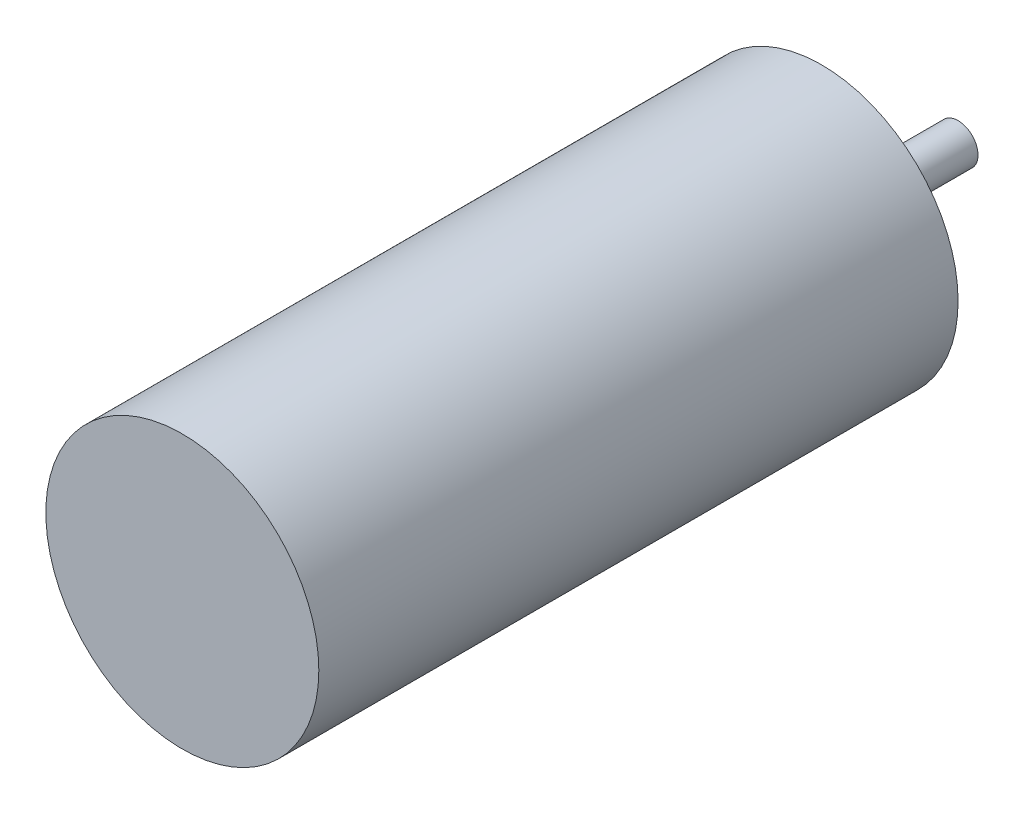
ISO-10303-21;
HEADER;
FILE_DESCRIPTION(('STEP AP214'),'2;1');
FILE_NAME('part.step','',(''),(''),'','','');
FILE_SCHEMA(('AUTOMOTIVE_DESIGN { 1 0 10303 214 1 1 1 1 }'));
ENDSEC;
DATA;
#1=APPLICATION_CONTEXT('core data for automotive mechanical design processes');
#2=APPLICATION_PROTOCOL_DEFINITION('international standard','automotive_design',2000,#1);
#3=PRODUCT_CONTEXT('',#1,'mechanical');
#4=PRODUCT('Part','Part','',(#3));
#5=PRODUCT_RELATED_PRODUCT_CATEGORY('part','',(#4));
#6=PRODUCT_DEFINITION_FORMATION('','',#4);
#7=PRODUCT_DEFINITION_CONTEXT('part definition',#1,'design');
#8=PRODUCT_DEFINITION('design','',#6,#7);
#9=PRODUCT_DEFINITION_SHAPE('','',#8);
#10=(LENGTH_UNIT() NAMED_UNIT(*) SI_UNIT(.MILLI.,.METRE.));
#11=(NAMED_UNIT(*) PLANE_ANGLE_UNIT() SI_UNIT($,.RADIAN.));
#12=(NAMED_UNIT(*) SI_UNIT($,.STERADIAN.) SOLID_ANGLE_UNIT());
#13=UNCERTAINTY_MEASURE_WITH_UNIT(LENGTH_MEASURE(1.E-05),#10,'distance_accuracy_value','');
#14=(GEOMETRIC_REPRESENTATION_CONTEXT(3) GLOBAL_UNCERTAINTY_ASSIGNED_CONTEXT((#13)) GLOBAL_UNIT_ASSIGNED_CONTEXT((#10,
#11,#12)) REPRESENTATION_CONTEXT('',''));
#15=CARTESIAN_POINT('',(0.,0.,0.));
#16=DIRECTION('',(0.,0.,1.));
#17=DIRECTION('',(1.,0.,0.));
#18=AXIS2_PLACEMENT_3D('',#15,#16,#17);
#19=CARTESIAN_POINT('',(0.,0.,56.2));
#20=DIRECTION('',(0.,0.,-1.));
#21=DIRECTION('',(-1.,0.,0.));
#22=AXIS2_PLACEMENT_3D('',#19,#20,#21);
#23=CYLINDRICAL_SURFACE('',#22,12.);
#24=CARTESIAN_POINT('',(0.,0.,56.2));
#25=DIRECTION('',(0.,0.,1.));
#26=DIRECTION('',(1.,0.,0.));
#27=AXIS2_PLACEMENT_3D('',#24,#25,#26);
#28=CIRCLE('',#27,12.);
#29=CARTESIAN_POINT('',(12.,0.,56.2));
#30=VERTEX_POINT('',#29);
#31=EDGE_CURVE('E36',#30,#30,#28,.T.);
#32=ORIENTED_EDGE('',*,*,#31,.F.);
#33=EDGE_LOOP('',(#32));
#34=FACE_BOUND('',#33,.T.);
#35=CARTESIAN_POINT('',(0.,0.,0.));
#36=DIRECTION('',(0.,0.,1.));
#37=DIRECTION('',(1.,0.,0.));
#38=AXIS2_PLACEMENT_3D('',#35,#36,#37);
#39=CIRCLE('',#38,12.);
#40=CARTESIAN_POINT('',(12.,0.,0.));
#41=VERTEX_POINT('',#40);
#42=EDGE_CURVE('E40',#41,#41,#39,.T.);
#43=ORIENTED_EDGE('',*,*,#42,.T.);
#44=EDGE_LOOP('',(#43));
#45=FACE_BOUND('',#44,.T.);
#46=ADVANCED_FACE('F30',(#34,#45),#23,.T.);
#47=CARTESIAN_POINT('',(0.,0.,56.2));
#48=DIRECTION('',(0.,0.,1.));
#49=DIRECTION('',(1.,0.,0.));
#50=AXIS2_PLACEMENT_3D('',#47,#48,#49);
#51=PLANE('',#50);
#52=ORIENTED_EDGE('',*,*,#31,.T.);
#53=EDGE_LOOP('',(#52));
#54=FACE_BOUND('',#53,.T.);
#55=ADVANCED_FACE('F61',(#54),#51,.T.);
#56=CARTESIAN_POINT('',(0.,0.,0.));
#57=DIRECTION('',(0.,0.,1.));
#58=DIRECTION('',(1.,0.,0.));
#59=AXIS2_PLACEMENT_3D('',#56,#57,#58);
#60=PLANE('',#59);
#61=CARTESIAN_POINT('',(0.,0.,0.));
#62=DIRECTION('',(0.,0.,1.));
#63=DIRECTION('',(1.,0.,0.));
#64=AXIS2_PLACEMENT_3D('',#61,#62,#63);
#65=CIRCLE('',#64,1.75);
#66=CARTESIAN_POINT('',(1.75,0.,0.));
#67=VERTEX_POINT('',#66);
#68=EDGE_CURVE('E10',#67,#67,#65,.F.);
#69=ORIENTED_EDGE('',*,*,#68,.F.);
#70=EDGE_LOOP('',(#69));
#71=FACE_BOUND('',#70,.T.);
#72=ORIENTED_EDGE('',*,*,#42,.F.);
#73=EDGE_LOOP('',(#72));
#74=FACE_BOUND('',#73,.T.);
#75=ADVANCED_FACE('F54',(#71,#74),#60,.F.);
#76=CARTESIAN_POINT('',(0.,0.,-12.));
#77=DIRECTION('',(0.,0.,1.));
#78=DIRECTION('',(1.,0.,0.));
#79=AXIS2_PLACEMENT_3D('',#76,#77,#78);
#80=CYLINDRICAL_SURFACE('',#79,1.75);
#81=CARTESIAN_POINT('',(0.,0.,-12.));
#82=DIRECTION('',(0.,0.,-1.));
#83=DIRECTION('',(-1.,0.,0.));
#84=AXIS2_PLACEMENT_3D('',#81,#82,#83);
#85=CIRCLE('',#84,1.75);
#86=CARTESIAN_POINT('',(-1.75,0.,-12.));
#87=VERTEX_POINT('',#86);
#88=EDGE_CURVE('E45',#87,#87,#85,.T.);
#89=ORIENTED_EDGE('',*,*,#88,.F.);
#90=EDGE_LOOP('',(#89));
#91=FACE_BOUND('',#90,.T.);
#92=ORIENTED_EDGE('',*,*,#68,.T.);
#93=EDGE_LOOP('',(#92));
#94=FACE_BOUND('',#93,.T.);
#95=ADVANCED_FACE('F52',(#91,#94),#80,.T.);
#96=CARTESIAN_POINT('',(0.,0.,-12.));
#97=DIRECTION('',(0.,0.,-1.));
#98=DIRECTION('',(-1.,0.,0.));
#99=AXIS2_PLACEMENT_3D('',#96,#97,#98);
#100=PLANE('',#99);
#101=ORIENTED_EDGE('',*,*,#88,.T.);
#102=EDGE_LOOP('',(#101));
#103=FACE_BOUND('',#102,.T.);
#104=ADVANCED_FACE('F50',(#103),#100,.T.);
#105=CLOSED_SHELL('',(#46,#55,#75,#95,#104));
#106=MANIFOLD_SOLID_BREP('B2',#105);
#107=ADVANCED_BREP_SHAPE_REPRESENTATION('',(#18,#106),#14);
#108=SHAPE_DEFINITION_REPRESENTATION(#9,#107);
ENDSEC;
END-ISO-10303-21;
